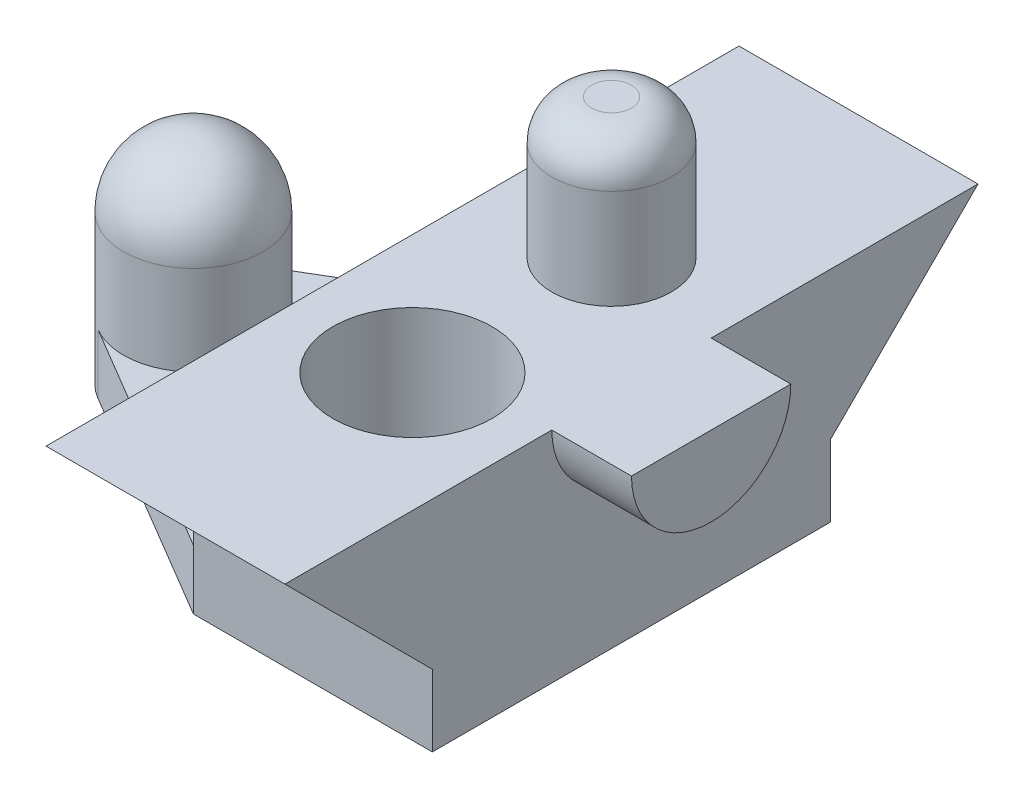
ISO-10303-21;
HEADER;
FILE_DESCRIPTION(('STEP AP214'),'2;1');
FILE_NAME('part.step','',(''),(''),'','','');
FILE_SCHEMA(('AUTOMOTIVE_DESIGN { 1 0 10303 214 1 1 1 1 }'));
ENDSEC;
DATA;
#1=APPLICATION_CONTEXT('core data for automotive mechanical design processes');
#2=APPLICATION_PROTOCOL_DEFINITION('international standard','automotive_design',2000,#1);
#3=PRODUCT_CONTEXT('',#1,'mechanical');
#4=PRODUCT('Part','Part','',(#3));
#5=PRODUCT_RELATED_PRODUCT_CATEGORY('part','',(#4));
#6=PRODUCT_DEFINITION_FORMATION('','',#4);
#7=PRODUCT_DEFINITION_CONTEXT('part definition',#1,'design');
#8=PRODUCT_DEFINITION('design','',#6,#7);
#9=PRODUCT_DEFINITION_SHAPE('','',#8);
#10=(LENGTH_UNIT() NAMED_UNIT(*) SI_UNIT(.MILLI.,.METRE.));
#11=(NAMED_UNIT(*) PLANE_ANGLE_UNIT() SI_UNIT($,.RADIAN.));
#12=(NAMED_UNIT(*) SI_UNIT($,.STERADIAN.) SOLID_ANGLE_UNIT());
#13=UNCERTAINTY_MEASURE_WITH_UNIT(LENGTH_MEASURE(1.E-05),#10,'distance_accuracy_value','');
#14=(GEOMETRIC_REPRESENTATION_CONTEXT(3) GLOBAL_UNCERTAINTY_ASSIGNED_CONTEXT((#13)) GLOBAL_UNIT_ASSIGNED_CONTEXT((#10,
#11,#12)) REPRESENTATION_CONTEXT('',''));
#15=CARTESIAN_POINT('',(0.,0.,0.));
#16=DIRECTION('',(0.,0.,1.));
#17=DIRECTION('',(1.,0.,0.));
#18=AXIS2_PLACEMENT_3D('',#15,#16,#17);
#19=CARTESIAN_POINT('',(11.,-1.5,5.));
#20=DIRECTION('',(0.,0.,-1.));
#21=DIRECTION('',(-1.,0.,0.));
#22=AXIS2_PLACEMENT_3D('',#19,#20,#21);
#23=PLANE('',#22);
#24=DIRECTION('',(1.,0.,0.));
#25=VECTOR('',#24,1.);
#26=CARTESIAN_POINT('',(5.00000000000001,0.300000000000042,5.));
#27=LINE('',#26,#25);
#28=CARTESIAN_POINT('',(5.,0.300000000000042,5.));
#29=VERTEX_POINT('',#28);
#30=CARTESIAN_POINT('',(11.,0.300000000000042,5.));
#31=VERTEX_POINT('',#30);
#32=EDGE_CURVE('E70',#29,#31,#27,.T.);
#33=ORIENTED_EDGE('',*,*,#32,.F.);
#34=DIRECTION('',(0.,-1.,0.));
#35=VECTOR('',#34,1.);
#36=CARTESIAN_POINT('',(5.,4.,5.));
#37=LINE('',#36,#35);
#38=CARTESIAN_POINT('',(5.,0.,5.));
#39=VERTEX_POINT('',#38);
#40=EDGE_CURVE('E212',#29,#39,#37,.T.);
#41=ORIENTED_EDGE('',*,*,#40,.T.);
#42=DIRECTION('',(0.,1.,0.));
#43=VECTOR('',#42,1.);
#44=CARTESIAN_POINT('',(5.,-1.5,5.));
#45=LINE('',#44,#43);
#46=CARTESIAN_POINT('',(5.,-1.5,5.));
#47=VERTEX_POINT('',#46);
#48=EDGE_CURVE('E256',#47,#39,#45,.T.);
#49=ORIENTED_EDGE('',*,*,#48,.F.);
#50=DIRECTION('',(-1.,0.,0.));
#51=VECTOR('',#50,1.);
#52=CARTESIAN_POINT('',(11.,-1.5,5.));
#53=LINE('',#52,#51);
#54=CARTESIAN_POINT('',(11.,-1.5,5.));
#55=VERTEX_POINT('',#54);
#56=EDGE_CURVE('E224',#55,#47,#53,.T.);
#57=ORIENTED_EDGE('',*,*,#56,.F.);
#58=DIRECTION('',(0.,1.,0.));
#59=VECTOR('',#58,1.);
#60=CARTESIAN_POINT('',(11.,-1.5,5.));
#61=LINE('',#60,#59);
#62=EDGE_CURVE('E260',#55,#31,#61,.T.);
#63=ORIENTED_EDGE('',*,*,#62,.T.);
#64=EDGE_LOOP('',(#33,#41,#49,#57,#63));
#65=FACE_BOUND('',#64,.T.);
#66=ADVANCED_FACE('F46',(#65),#23,.F.);
#67=CARTESIAN_POINT('',(5.,-1.5,-5.));
#68=DIRECTION('',(0.,0.,1.));
#69=DIRECTION('',(1.,0.,0.));
#70=AXIS2_PLACEMENT_3D('',#67,#68,#69);
#71=PLANE('',#70);
#72=DIRECTION('',(0.,-1.,0.));
#73=VECTOR('',#72,1.);
#74=CARTESIAN_POINT('',(5.,4.,-5.));
#75=LINE('',#74,#73);
#76=CARTESIAN_POINT('',(5.,0.300000000000041,-5.));
#77=VERTEX_POINT('',#76);
#78=CARTESIAN_POINT('',(5.,0.,-5.));
#79=VERTEX_POINT('',#78);
#80=EDGE_CURVE('E206',#77,#79,#75,.T.);
#81=ORIENTED_EDGE('',*,*,#80,.F.);
#82=DIRECTION('',(1.,0.,0.));
#83=VECTOR('',#82,1.);
#84=CARTESIAN_POINT('',(5.,0.300000000000041,-5.));
#85=LINE('',#84,#83);
#86=CARTESIAN_POINT('',(11.,0.300000000000041,-5.));
#87=VERTEX_POINT('',#86);
#88=EDGE_CURVE('E147',#77,#87,#85,.T.);
#89=ORIENTED_EDGE('',*,*,#88,.T.);
#90=DIRECTION('',(0.,1.,0.));
#91=VECTOR('',#90,1.);
#92=CARTESIAN_POINT('',(11.,-1.5,-5.));
#93=LINE('',#92,#91);
#94=CARTESIAN_POINT('',(11.,-1.5,-5.));
#95=VERTEX_POINT('',#94);
#96=EDGE_CURVE('E152',#95,#87,#93,.T.);
#97=ORIENTED_EDGE('',*,*,#96,.F.);
#98=DIRECTION('',(1.,0.,0.));
#99=VECTOR('',#98,1.);
#100=CARTESIAN_POINT('',(5.,-1.5,-5.));
#101=LINE('',#100,#99);
#102=CARTESIAN_POINT('',(5.,-1.5,-5.));
#103=VERTEX_POINT('',#102);
#104=EDGE_CURVE('E216',#103,#95,#101,.T.);
#105=ORIENTED_EDGE('',*,*,#104,.F.);
#106=DIRECTION('',(0.,1.,0.));
#107=VECTOR('',#106,1.);
#108=CARTESIAN_POINT('',(5.,-1.5,-5.));
#109=LINE('',#108,#107);
#110=EDGE_CURVE('E238',#103,#79,#109,.T.);
#111=ORIENTED_EDGE('',*,*,#110,.T.);
#112=EDGE_LOOP('',(#81,#89,#97,#105,#111));
#113=FACE_BOUND('',#112,.T.);
#114=ADVANCED_FACE('F291',(#113),#71,.F.);
#115=CARTESIAN_POINT('',(11.,-1.5,-5.));
#116=DIRECTION('',(-1.,0.,0.));
#117=DIRECTION('',(0.,0.,1.));
#118=AXIS2_PLACEMENT_3D('',#115,#116,#117);
#119=PLANE('',#118);
#120=CARTESIAN_POINT('',(11.,4.,0.));
#121=DIRECTION('',(1.,0.,0.));
#122=DIRECTION('',(0.,0.,-1.));
#123=AXIS2_PLACEMENT_3D('',#120,#121,#122);
#124=CIRCLE('',#123,2.);
#125=CARTESIAN_POINT('',(11.,4.,2.));
#126=VERTEX_POINT('',#125);
#127=CARTESIAN_POINT('',(11.,4.,-2.));
#128=VERTEX_POINT('',#127);
#129=EDGE_CURVE('E170',#126,#128,#124,.T.);
#130=ORIENTED_EDGE('',*,*,#129,.F.);
#131=DIRECTION('',(0.,0.,-1.));
#132=VECTOR('',#131,1.);
#133=CARTESIAN_POINT('',(11.,4.,-5.));
#134=LINE('',#133,#132);
#135=CARTESIAN_POINT('',(11.,4.,8.7));
#136=VERTEX_POINT('',#135);
#137=EDGE_CURVE('E140',#136,#126,#134,.T.);
#138=ORIENTED_EDGE('',*,*,#137,.F.);
#139=DIRECTION('',(0.,-0.707106781186543,-0.707106781186552));
#140=VECTOR('',#139,1.);
#141=CARTESIAN_POINT('',(11.,4.,8.7));
#142=LINE('',#141,#140);
#143=EDGE_CURVE('E154',#136,#31,#142,.T.);
#144=ORIENTED_EDGE('',*,*,#143,.T.);
#145=ORIENTED_EDGE('',*,*,#62,.F.);
#146=DIRECTION('',(0.,0.,1.));
#147=VECTOR('',#146,1.);
#148=CARTESIAN_POINT('',(11.,-1.5,-5.));
#149=LINE('',#148,#147);
#150=EDGE_CURVE('E220',#95,#55,#149,.T.);
#151=ORIENTED_EDGE('',*,*,#150,.F.);
#152=ORIENTED_EDGE('',*,*,#96,.T.);
#153=DIRECTION('',(0.,0.707106781186544,-0.707106781186552));
#154=VECTOR('',#153,1.);
#155=CARTESIAN_POINT('',(11.,4.,-8.7));
#156=LINE('',#155,#154);
#157=CARTESIAN_POINT('',(11.,4.,-8.7));
#158=VERTEX_POINT('',#157);
#159=EDGE_CURVE('E62',#87,#158,#156,.T.);
#160=ORIENTED_EDGE('',*,*,#159,.T.);
#161=EDGE_CURVE('E131',#128,#158,#134,.T.);
#162=ORIENTED_EDGE('',*,*,#161,.F.);
#163=EDGE_LOOP('',(#130,#138,#144,#145,#151,#152,#160,#162));
#164=FACE_BOUND('',#163,.T.);
#165=ADVANCED_FACE('F150',(#164),#119,.F.);
#166=CARTESIAN_POINT('',(5.,-1.5,5.));
#167=DIRECTION('',(0.510109480302236,0.,-0.860109480302236));
#168=DIRECTION('',(-0.860109480302236,0.,-0.510109480302236));
#169=AXIS2_PLACEMENT_3D('',#166,#167,#168);
#170=PLANE('',#169);
#171=DIRECTION('',(-0.860109480302236,0.,-0.510109480302236));
#172=VECTOR('',#171,1.);
#173=CARTESIAN_POINT('',(5.,0.,5.));
#174=LINE('',#173,#172);
#175=CARTESIAN_POINT('',(-0.892691590528913,0.,1.50519159052891));
#176=VERTEX_POINT('',#175);
#177=EDGE_CURVE('E215',#39,#176,#174,.T.);
#178=ORIENTED_EDGE('',*,*,#177,.T.);
#179=DIRECTION('',(0.,1.,0.));
#180=VECTOR('',#179,1.);
#181=CARTESIAN_POINT('',(-0.892691590528913,-1.5,1.50519159052891));
#182=LINE('',#181,#180);
#183=CARTESIAN_POINT('',(-0.892691590528913,-1.5,1.50519159052891));
#184=VERTEX_POINT('',#183);
#185=EDGE_CURVE('E252',#184,#176,#182,.T.);
#186=ORIENTED_EDGE('',*,*,#185,.F.);
#187=DIRECTION('',(-0.860109480302236,0.,-0.510109480302236));
#188=VECTOR('',#187,1.);
#189=CARTESIAN_POINT('',(5.,-1.5,5.));
#190=LINE('',#189,#188);
#191=EDGE_CURVE('E227',#47,#184,#190,.T.);
#192=ORIENTED_EDGE('',*,*,#191,.F.);
#193=ORIENTED_EDGE('',*,*,#48,.T.);
#194=EDGE_LOOP('',(#178,#186,#192,#193));
#195=FACE_BOUND('',#194,.T.);
#196=ADVANCED_FACE('F301',(#195),#170,.F.);
#197=CARTESIAN_POINT('',(0.,-1.5,0.));
#198=DIRECTION('',(0.,1.,0.));
#199=DIRECTION('',(0.,0.,1.));
#200=AXIS2_PLACEMENT_3D('',#197,#198,#199);
#201=CYLINDRICAL_SURFACE('',#200,1.75);
#202=CARTESIAN_POINT('',(0.,2.25,0.));
#203=DIRECTION('',(0.,1.,0.));
#204=DIRECTION('',(0.,0.,1.));
#205=AXIS2_PLACEMENT_3D('',#202,#203,#204);
#206=CIRCLE('',#205,1.75);
#207=CARTESIAN_POINT('',(0.,2.25,1.75));
#208=VERTEX_POINT('',#207);
#209=EDGE_CURVE('E268',#208,#208,#206,.F.);
#210=ORIENTED_EDGE('',*,*,#209,.T.);
#211=EDGE_LOOP('',(#210));
#212=FACE_BOUND('',#211,.T.);
#213=ORIENTED_EDGE('',*,*,#185,.T.);
#214=CARTESIAN_POINT('',(0.,0.,0.));
#215=DIRECTION('',(0.,1.,0.));
#216=DIRECTION('',(0.,0.,1.));
#217=AXIS2_PLACEMENT_3D('',#214,#215,#216);
#218=CIRCLE('',#217,1.75);
#219=CARTESIAN_POINT('',(-0.892691590528913,0.,-1.50519159052891));
#220=VERTEX_POINT('',#219);
#221=EDGE_CURVE('E265',#220,#176,#218,.F.);
#222=ORIENTED_EDGE('',*,*,#221,.F.);
#223=DIRECTION('',(0.,1.,0.));
#224=VECTOR('',#223,1.);
#225=CARTESIAN_POINT('',(-0.892691590528913,-1.5,-1.50519159052891));
#226=LINE('',#225,#224);
#227=CARTESIAN_POINT('',(-0.892691590528913,-1.5,-1.50519159052891));
#228=VERTEX_POINT('',#227);
#229=EDGE_CURVE('E248',#228,#220,#226,.T.);
#230=ORIENTED_EDGE('',*,*,#229,.F.);
#231=CARTESIAN_POINT('',(0.,-1.5,0.));
#232=DIRECTION('',(0.,1.,0.));
#233=DIRECTION('',(0.,0.,1.));
#234=AXIS2_PLACEMENT_3D('',#231,#232,#233);
#235=CIRCLE('',#234,1.75);
#236=EDGE_CURVE('E230',#228,#184,#235,.T.);
#237=ORIENTED_EDGE('',*,*,#236,.T.);
#238=EDGE_LOOP('',(#213,#222,#230,#237));
#239=FACE_BOUND('',#238,.T.);
#240=ADVANCED_FACE('F319',(#212,#239),#201,.T.);
#241=CARTESIAN_POINT('',(5.,-1.5,-5.));
#242=DIRECTION('',(-0.510109480302236,0.,-0.860109480302236));
#243=DIRECTION('',(-0.860109480302236,0.,0.510109480302236));
#244=AXIS2_PLACEMENT_3D('',#241,#242,#243);
#245=PLANE('',#244);
#246=DIRECTION('',(-0.860109480302236,0.,0.510109480302236));
#247=VECTOR('',#246,1.);
#248=CARTESIAN_POINT('',(5.,0.,-5.));
#249=LINE('',#248,#247);
#250=EDGE_CURVE('E221',#79,#220,#249,.T.);
#251=ORIENTED_EDGE('',*,*,#250,.F.);
#252=ORIENTED_EDGE('',*,*,#110,.F.);
#253=DIRECTION('',(-0.860109480302236,0.,0.510109480302236));
#254=VECTOR('',#253,1.);
#255=CARTESIAN_POINT('',(5.,-1.5,-5.));
#256=LINE('',#255,#254);
#257=EDGE_CURVE('E234',#103,#228,#256,.T.);
#258=ORIENTED_EDGE('',*,*,#257,.T.);
#259=ORIENTED_EDGE('',*,*,#229,.T.);
#260=EDGE_LOOP('',(#251,#252,#258,#259));
#261=FACE_BOUND('',#260,.T.);
#262=ADVANCED_FACE('F321',(#261),#245,.T.);
#263=CARTESIAN_POINT('',(0.,-1.5,0.));
#264=DIRECTION('',(0.,1.,0.));
#265=DIRECTION('',(0.,0.,1.));
#266=AXIS2_PLACEMENT_3D('',#263,#264,#265);
#267=PLANE('',#266);
#268=ORIENTED_EDGE('',*,*,#104,.T.);
#269=ORIENTED_EDGE('',*,*,#150,.T.);
#270=ORIENTED_EDGE('',*,*,#56,.T.);
#271=ORIENTED_EDGE('',*,*,#191,.T.);
#272=ORIENTED_EDGE('',*,*,#236,.F.);
#273=ORIENTED_EDGE('',*,*,#257,.F.);
#274=EDGE_LOOP('',(#268,#269,#270,#271,#272,#273));
#275=FACE_BOUND('',#274,.T.);
#276=ADVANCED_FACE('F336',(#275),#267,.F.);
#277=CARTESIAN_POINT('',(0.,0.,0.));
#278=DIRECTION('',(0.,1.,0.));
#279=DIRECTION('',(0.,0.,1.));
#280=AXIS2_PLACEMENT_3D('',#277,#278,#279);
#281=PLANE('',#280);
#282=ORIENTED_EDGE('',*,*,#250,.T.);
#283=ORIENTED_EDGE('',*,*,#221,.T.);
#284=ORIENTED_EDGE('',*,*,#177,.F.);
#285=DIRECTION('',(0.,0.,1.));
#286=VECTOR('',#285,1.);
#287=CARTESIAN_POINT('',(5.,0.,-5.));
#288=LINE('',#287,#286);
#289=EDGE_CURVE('E201',#79,#39,#288,.T.);
#290=ORIENTED_EDGE('',*,*,#289,.F.);
#291=EDGE_LOOP('',(#282,#283,#284,#290));
#292=FACE_BOUND('',#291,.T.);
#293=ADVANCED_FACE('F330',(#292),#281,.T.);
#294=CARTESIAN_POINT('',(5.,4.,-5.));
#295=DIRECTION('',(1.,0.,0.));
#296=DIRECTION('',(0.,0.,-1.));
#297=AXIS2_PLACEMENT_3D('',#294,#295,#296);
#298=PLANE('',#297);
#299=ORIENTED_EDGE('',*,*,#289,.T.);
#300=ORIENTED_EDGE('',*,*,#40,.F.);
#301=DIRECTION('',(0.,-0.707106781186543,-0.707106781186552));
#302=VECTOR('',#301,1.);
#303=CARTESIAN_POINT('',(5.00000000000001,4.,8.7));
#304=LINE('',#303,#302);
#305=CARTESIAN_POINT('',(5.00000000000001,4.,8.7));
#306=VERTEX_POINT('',#305);
#307=EDGE_CURVE('E159',#306,#29,#304,.T.);
#308=ORIENTED_EDGE('',*,*,#307,.F.);
#309=DIRECTION('',(0.,0.,1.));
#310=VECTOR('',#309,1.);
#311=CARTESIAN_POINT('',(5.,4.,-5.));
#312=LINE('',#311,#310);
#313=CARTESIAN_POINT('',(5.,4.,-8.7));
#314=VERTEX_POINT('',#313);
#315=EDGE_CURVE('E141',#314,#306,#312,.T.);
#316=ORIENTED_EDGE('',*,*,#315,.F.);
#317=DIRECTION('',(0.,0.707106781186544,-0.707106781186552));
#318=VECTOR('',#317,1.);
#319=CARTESIAN_POINT('',(5.,4.,-8.7));
#320=LINE('',#319,#318);
#321=EDGE_CURVE('E145',#77,#314,#320,.T.);
#322=ORIENTED_EDGE('',*,*,#321,.F.);
#323=ORIENTED_EDGE('',*,*,#80,.T.);
#324=EDGE_LOOP('',(#299,#300,#308,#316,#322,#323));
#325=FACE_BOUND('',#324,.T.);
#326=ADVANCED_FACE('F314',(#325),#298,.F.);
#327=CARTESIAN_POINT('',(0.,4.,0.));
#328=DIRECTION('',(0.,1.,0.));
#329=DIRECTION('',(0.,0.,1.));
#330=AXIS2_PLACEMENT_3D('',#327,#328,#329);
#331=PLANE('',#330);
#332=CARTESIAN_POINT('',(8.,4.,2.5));
#333=DIRECTION('',(0.,1.,0.));
#334=DIRECTION('',(0.,0.,1.));
#335=AXIS2_PLACEMENT_3D('',#332,#333,#334);
#336=CIRCLE('',#335,2.);
#337=CARTESIAN_POINT('',(8.,4.,4.5));
#338=VERTEX_POINT('',#337);
#339=EDGE_CURVE('E189',#338,#338,#336,.T.);
#340=ORIENTED_EDGE('',*,*,#339,.F.);
#341=EDGE_LOOP('',(#340));
#342=FACE_BOUND('',#341,.T.);
#343=CARTESIAN_POINT('',(8.,4.,-2.5));
#344=DIRECTION('',(0.,1.,0.));
#345=DIRECTION('',(0.,0.,1.));
#346=AXIS2_PLACEMENT_3D('',#343,#344,#345);
#347=CIRCLE('',#346,1.5);
#348=CARTESIAN_POINT('',(8.,4.,-1.));
#349=VERTEX_POINT('',#348);
#350=EDGE_CURVE('E194',#349,#349,#347,.T.);
#351=ORIENTED_EDGE('',*,*,#350,.F.);
#352=EDGE_LOOP('',(#351));
#353=FACE_BOUND('',#352,.T.);
#354=ORIENTED_EDGE('',*,*,#315,.T.);
#355=DIRECTION('',(1.,0.,0.));
#356=VECTOR('',#355,1.);
#357=CARTESIAN_POINT('',(5.00000000000001,4.,8.7));
#358=LINE('',#357,#356);
#359=EDGE_CURVE('E166',#306,#136,#358,.T.);
#360=ORIENTED_EDGE('',*,*,#359,.T.);
#361=ORIENTED_EDGE('',*,*,#137,.T.);
#362=DIRECTION('',(-1.,0.,0.));
#363=VECTOR('',#362,1.);
#364=CARTESIAN_POINT('',(13.,4.,2.));
#365=LINE('',#364,#363);
#366=CARTESIAN_POINT('',(13.,4.,2.));
#367=VERTEX_POINT('',#366);
#368=EDGE_CURVE('E181',#367,#126,#365,.T.);
#369=ORIENTED_EDGE('',*,*,#368,.F.);
#370=DIRECTION('',(0.,0.,1.));
#371=VECTOR('',#370,1.);
#372=CARTESIAN_POINT('',(13.,4.,2.));
#373=LINE('',#372,#371);
#374=CARTESIAN_POINT('',(13.,4.,-2.));
#375=VERTEX_POINT('',#374);
#376=EDGE_CURVE('E178',#375,#367,#373,.T.);
#377=ORIENTED_EDGE('',*,*,#376,.F.);
#378=DIRECTION('',(-1.,0.,0.));
#379=VECTOR('',#378,1.);
#380=CARTESIAN_POINT('',(13.,4.,-2.));
#381=LINE('',#380,#379);
#382=EDGE_CURVE('E136',#375,#128,#381,.T.);
#383=ORIENTED_EDGE('',*,*,#382,.T.);
#384=ORIENTED_EDGE('',*,*,#161,.T.);
#385=DIRECTION('',(1.,0.,0.));
#386=VECTOR('',#385,1.);
#387=CARTESIAN_POINT('',(5.,4.,-8.7));
#388=LINE('',#387,#386);
#389=EDGE_CURVE('E133',#314,#158,#388,.T.);
#390=ORIENTED_EDGE('',*,*,#389,.F.);
#391=EDGE_LOOP('',(#354,#360,#361,#369,#377,#383,#384,#390));
#392=FACE_BOUND('',#391,.T.);
#393=ADVANCED_FACE('F132',(#342,#353,#392),#331,.T.);
#394=CARTESIAN_POINT('',(0.,2.25,0.));
#395=DIRECTION('',(0.,1.,0.));
#396=DIRECTION('',(0.,0.,1.));
#397=AXIS2_PLACEMENT_3D('',#394,#395,#396);
#398=SPHERICAL_SURFACE('',#397,1.75);
#399=ORIENTED_EDGE('',*,*,#209,.F.);
#400=EDGE_LOOP('',(#399));
#401=FACE_BOUND('',#400,.T.);
#402=ADVANCED_FACE('F304',(#401),#398,.T.);
#403=CARTESIAN_POINT('',(8.,7.5,-2.5));
#404=DIRECTION('',(0.,-1.,0.));
#405=DIRECTION('',(0.,0.,-1.));
#406=AXIS2_PLACEMENT_3D('',#403,#404,#405);
#407=CYLINDRICAL_SURFACE('',#406,1.5);
#408=CARTESIAN_POINT('',(8.,6.5,-2.5));
#409=DIRECTION('',(0.,1.,0.));
#410=DIRECTION('',(0.,0.,1.));
#411=AXIS2_PLACEMENT_3D('',#408,#409,#410);
#412=CIRCLE('',#411,1.5);
#413=CARTESIAN_POINT('',(8.,6.5,-1.));
#414=VERTEX_POINT('',#413);
#415=EDGE_CURVE('E11',#414,#414,#412,.F.);
#416=ORIENTED_EDGE('',*,*,#415,.T.);
#417=EDGE_LOOP('',(#416));
#418=FACE_BOUND('',#417,.T.);
#419=ORIENTED_EDGE('',*,*,#350,.T.);
#420=EDGE_LOOP('',(#419));
#421=FACE_BOUND('',#420,.T.);
#422=ADVANCED_FACE('F287',(#418,#421),#407,.T.);
#423=CARTESIAN_POINT('',(8.,7.5,-2.5));
#424=DIRECTION('',(0.,1.,0.));
#425=DIRECTION('',(0.,0.,1.));
#426=AXIS2_PLACEMENT_3D('',#423,#424,#425);
#427=PLANE('',#426);
#428=CARTESIAN_POINT('',(8.,7.5,-2.5));
#429=DIRECTION('',(0.,1.,0.));
#430=DIRECTION('',(0.,0.,1.));
#431=AXIS2_PLACEMENT_3D('',#428,#429,#430);
#432=CIRCLE('',#431,0.5);
#433=CARTESIAN_POINT('',(8.,7.5,-2.));
#434=VERTEX_POINT('',#433);
#435=EDGE_CURVE('E55',#434,#434,#432,.T.);
#436=ORIENTED_EDGE('',*,*,#435,.T.);
#437=EDGE_LOOP('',(#436));
#438=FACE_BOUND('',#437,.T.);
#439=ADVANCED_FACE('F275',(#438),#427,.T.);
#440=CARTESIAN_POINT('',(8.,6.5,-2.5));
#441=DIRECTION('',(0.,1.,0.));
#442=DIRECTION('',(0.,0.,1.));
#443=AXIS2_PLACEMENT_3D('',#440,#441,#442);
#444=DEGENERATE_TOROIDAL_SURFACE('',#443,0.5,1.,.T.);
#445=ORIENTED_EDGE('',*,*,#415,.F.);
#446=EDGE_LOOP('',(#445));
#447=FACE_BOUND('',#446,.T.);
#448=ORIENTED_EDGE('',*,*,#435,.F.);
#449=EDGE_LOOP('',(#448));
#450=FACE_BOUND('',#449,.T.);
#451=ADVANCED_FACE('F48',(#447,#450),#444,.T.);
#452=CARTESIAN_POINT('',(8.,0.25,2.5));
#453=DIRECTION('',(0.,1.,0.));
#454=DIRECTION('',(0.,0.,1.));
#455=AXIS2_PLACEMENT_3D('',#452,#453,#454);
#456=CYLINDRICAL_SURFACE('',#455,2.);
#457=CARTESIAN_POINT('',(8.,0.25,2.5));
#458=DIRECTION('',(0.,1.,0.));
#459=DIRECTION('',(0.,0.,1.));
#460=AXIS2_PLACEMENT_3D('',#457,#458,#459);
#461=CIRCLE('',#460,2.);
#462=CARTESIAN_POINT('',(8.,0.25,4.5));
#463=VERTEX_POINT('',#462);
#464=EDGE_CURVE('E190',#463,#463,#461,.T.);
#465=ORIENTED_EDGE('',*,*,#464,.F.);
#466=EDGE_LOOP('',(#465));
#467=FACE_BOUND('',#466,.T.);
#468=ORIENTED_EDGE('',*,*,#339,.T.);
#469=EDGE_LOOP('',(#468));
#470=FACE_BOUND('',#469,.T.);
#471=ADVANCED_FACE('F278',(#467,#470),#456,.F.);
#472=CARTESIAN_POINT('',(8.,0.25,2.5));
#473=DIRECTION('',(0.,1.,0.));
#474=DIRECTION('',(0.,0.,1.));
#475=AXIS2_PLACEMENT_3D('',#472,#473,#474);
#476=PLANE('',#475);
#477=ORIENTED_EDGE('',*,*,#464,.T.);
#478=EDGE_LOOP('',(#477));
#479=FACE_BOUND('',#478,.T.);
#480=ADVANCED_FACE('F284',(#479),#476,.T.);
#481=CARTESIAN_POINT('',(13.,4.,0.));
#482=DIRECTION('',(-1.,0.,0.));
#483=DIRECTION('',(0.,0.,1.));
#484=AXIS2_PLACEMENT_3D('',#481,#482,#483);
#485=CYLINDRICAL_SURFACE('',#484,2.);
#486=ORIENTED_EDGE('',*,*,#129,.T.);
#487=ORIENTED_EDGE('',*,*,#382,.F.);
#488=CARTESIAN_POINT('',(13.,4.,0.));
#489=DIRECTION('',(1.,0.,0.));
#490=DIRECTION('',(0.,0.,-1.));
#491=AXIS2_PLACEMENT_3D('',#488,#489,#490);
#492=CIRCLE('',#491,2.);
#493=EDGE_CURVE('E174',#367,#375,#492,.T.);
#494=ORIENTED_EDGE('',*,*,#493,.F.);
#495=ORIENTED_EDGE('',*,*,#368,.T.);
#496=EDGE_LOOP('',(#486,#487,#494,#495));
#497=FACE_BOUND('',#496,.T.);
#498=ADVANCED_FACE('F350',(#497),#485,.T.);
#499=CARTESIAN_POINT('',(13.,4.,0.));
#500=DIRECTION('',(1.,0.,0.));
#501=DIRECTION('',(0.,0.,-1.));
#502=AXIS2_PLACEMENT_3D('',#499,#500,#501);
#503=PLANE('',#502);
#504=ORIENTED_EDGE('',*,*,#493,.T.);
#505=ORIENTED_EDGE('',*,*,#376,.T.);
#506=EDGE_LOOP('',(#504,#505));
#507=FACE_BOUND('',#506,.T.);
#508=ADVANCED_FACE('F352',(#507),#503,.T.);
#509=CARTESIAN_POINT('',(5.00000000000001,4.,8.7));
#510=DIRECTION('',(0.,-0.707106781186552,0.707106781186543));
#511=DIRECTION('',(0.,-0.707106781186543,-0.707106781186552));
#512=AXIS2_PLACEMENT_3D('',#509,#510,#511);
#513=PLANE('',#512);
#514=ORIENTED_EDGE('',*,*,#143,.F.);
#515=ORIENTED_EDGE('',*,*,#359,.F.);
#516=ORIENTED_EDGE('',*,*,#307,.T.);
#517=ORIENTED_EDGE('',*,*,#32,.T.);
#518=EDGE_LOOP('',(#514,#515,#516,#517));
#519=FACE_BOUND('',#518,.T.);
#520=ADVANCED_FACE('F344',(#519),#513,.T.);
#521=CARTESIAN_POINT('',(5.,4.,-8.7));
#522=DIRECTION('',(0.,-0.707106781186552,-0.707106781186543));
#523=DIRECTION('',(0.,0.707106781186543,-0.707106781186552));
#524=AXIS2_PLACEMENT_3D('',#521,#522,#523);
#525=PLANE('',#524);
#526=ORIENTED_EDGE('',*,*,#159,.F.);
#527=ORIENTED_EDGE('',*,*,#88,.F.);
#528=ORIENTED_EDGE('',*,*,#321,.T.);
#529=ORIENTED_EDGE('',*,*,#389,.T.);
#530=EDGE_LOOP('',(#526,#527,#528,#529));
#531=FACE_BOUND('',#530,.T.);
#532=ADVANCED_FACE('F143',(#531),#525,.T.);
#533=CLOSED_SHELL('',(#66,#114,#165,#196,#240,#262,#276,#293,#326,#393,#402,#422,#439,#451,#471,
#480,#498,#508,#520,#532));
#534=MANIFOLD_SOLID_BREP('B2',#533);
#535=ADVANCED_BREP_SHAPE_REPRESENTATION('',(#18,#534),#14);
#536=SHAPE_DEFINITION_REPRESENTATION(#9,#535);
ENDSEC;
END-ISO-10303-21;
